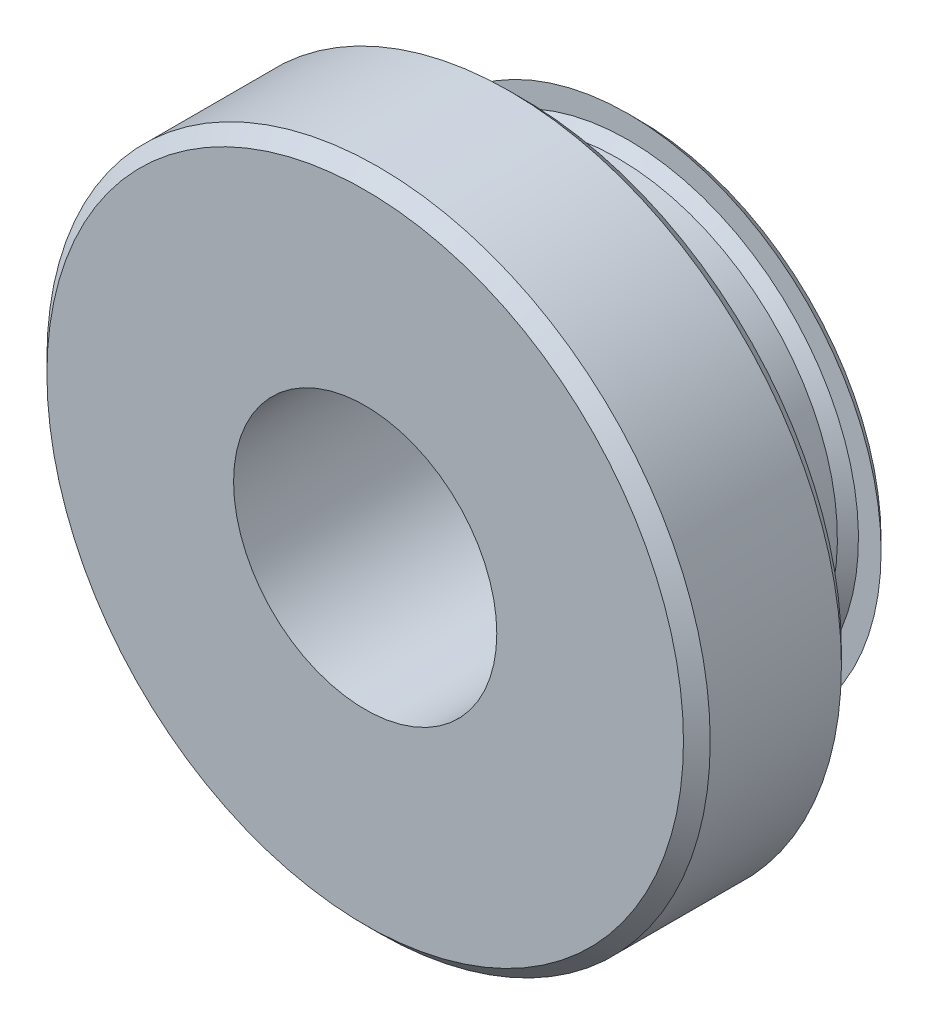
ISO-10303-21;
HEADER;
FILE_DESCRIPTION(('STEP AP214'),'2;1');
FILE_NAME('part.step','',(''),(''),'','','');
FILE_SCHEMA(('AUTOMOTIVE_DESIGN { 1 0 10303 214 1 1 1 1 }'));
ENDSEC;
DATA;
#1=APPLICATION_CONTEXT('core data for automotive mechanical design processes');
#2=APPLICATION_PROTOCOL_DEFINITION('international standard','automotive_design',2000,#1);
#3=PRODUCT_CONTEXT('',#1,'mechanical');
#4=PRODUCT('Part','Part','',(#3));
#5=PRODUCT_RELATED_PRODUCT_CATEGORY('part','',(#4));
#6=PRODUCT_DEFINITION_FORMATION('','',#4);
#7=PRODUCT_DEFINITION_CONTEXT('part definition',#1,'design');
#8=PRODUCT_DEFINITION('design','',#6,#7);
#9=PRODUCT_DEFINITION_SHAPE('','',#8);
#10=(LENGTH_UNIT() NAMED_UNIT(*) SI_UNIT(.MILLI.,.METRE.));
#11=(NAMED_UNIT(*) PLANE_ANGLE_UNIT() SI_UNIT($,.RADIAN.));
#12=(NAMED_UNIT(*) SI_UNIT($,.STERADIAN.) SOLID_ANGLE_UNIT());
#13=UNCERTAINTY_MEASURE_WITH_UNIT(LENGTH_MEASURE(1.E-05),#10,'distance_accuracy_value','');
#14=(GEOMETRIC_REPRESENTATION_CONTEXT(3) GLOBAL_UNCERTAINTY_ASSIGNED_CONTEXT((#13)) GLOBAL_UNIT_ASSIGNED_CONTEXT((#10,
#11,#12)) REPRESENTATION_CONTEXT('',''));
#15=CARTESIAN_POINT('',(0.,0.,0.));
#16=DIRECTION('',(0.,0.,1.));
#17=DIRECTION('',(1.,0.,0.));
#18=AXIS2_PLACEMENT_3D('',#15,#16,#17);
#19=CARTESIAN_POINT('',(0.,0.,-1.5));
#20=DIRECTION('',(0.,0.,1.));
#21=DIRECTION('',(1.,0.,0.));
#22=AXIS2_PLACEMENT_3D('',#19,#20,#21);
#23=PLANE('',#22);
#24=CARTESIAN_POINT('',(0.,0.,-1.5));
#25=DIRECTION('',(0.,0.,1.));
#26=DIRECTION('',(1.,0.,0.));
#27=AXIS2_PLACEMENT_3D('',#24,#25,#26);
#28=CIRCLE('',#27,3.023);
#29=CARTESIAN_POINT('',(3.023,0.,-1.5));
#30=VERTEX_POINT('',#29);
#31=EDGE_CURVE('E75',#30,#30,#28,.F.);
#32=ORIENTED_EDGE('',*,*,#31,.T.);
#33=EDGE_LOOP('',(#32));
#34=FACE_BOUND('',#33,.T.);
#35=CARTESIAN_POINT('',(0.,0.,-1.5));
#36=DIRECTION('',(0.,0.,-1.));
#37=DIRECTION('',(0.,1.,0.));
#38=AXIS2_PLACEMENT_3D('',#35,#36,#37);
#39=CIRCLE('',#38,2.085);
#40=CARTESIAN_POINT('',(0.,2.085,-1.5));
#41=VERTEX_POINT('',#40);
#42=EDGE_CURVE('E55',#41,#41,#39,.T.);
#43=ORIENTED_EDGE('',*,*,#42,.F.);
#44=EDGE_LOOP('',(#43));
#45=FACE_BOUND('',#44,.T.);
#46=ADVANCED_FACE('F34',(#34,#45),#23,.F.);
#47=CARTESIAN_POINT('',(0.,0.,-1.5));
#48=DIRECTION('',(0.,0.,1.));
#49=DIRECTION('',(1.,0.,0.));
#50=AXIS2_PLACEMENT_3D('',#47,#48,#49);
#51=CYLINDRICAL_SURFACE('',#50,3.15);
#52=CARTESIAN_POINT('',(0.,0.,-0.127000000000003));
#53=DIRECTION('',(0.,0.,1.));
#54=DIRECTION('',(1.,0.,0.));
#55=AXIS2_PLACEMENT_3D('',#52,#53,#54);
#56=CIRCLE('',#55,3.15);
#57=CARTESIAN_POINT('',(3.15,0.,-0.127000000000003));
#58=VERTEX_POINT('',#57);
#59=EDGE_CURVE('E72',#58,#58,#56,.F.);
#60=ORIENTED_EDGE('',*,*,#59,.T.);
#61=EDGE_LOOP('',(#60));
#62=FACE_BOUND('',#61,.T.);
#63=CARTESIAN_POINT('',(0.,0.,-1.373));
#64=DIRECTION('',(0.,0.,1.));
#65=DIRECTION('',(1.,0.,0.));
#66=AXIS2_PLACEMENT_3D('',#63,#64,#65);
#67=CIRCLE('',#66,3.15);
#68=CARTESIAN_POINT('',(3.15,0.,-1.373));
#69=VERTEX_POINT('',#68);
#70=EDGE_CURVE('E69',#69,#69,#67,.T.);
#71=ORIENTED_EDGE('',*,*,#70,.T.);
#72=EDGE_LOOP('',(#71));
#73=FACE_BOUND('',#72,.T.);
#74=ADVANCED_FACE('F106',(#62,#73),#51,.T.);
#75=CARTESIAN_POINT('',(0.,0.,0.));
#76=DIRECTION('',(0.,0.,1.));
#77=DIRECTION('',(1.,0.,0.));
#78=AXIS2_PLACEMENT_3D('',#75,#76,#77);
#79=PLANE('',#78);
#80=CARTESIAN_POINT('',(0.,0.,0.));
#81=DIRECTION('',(0.,0.,1.));
#82=DIRECTION('',(1.,0.,0.));
#83=AXIS2_PLACEMENT_3D('',#80,#81,#82);
#84=CIRCLE('',#83,1.24999999999999);
#85=CARTESIAN_POINT('',(1.24999999999999,0.,0.));
#86=VERTEX_POINT('',#85);
#87=EDGE_CURVE('E56',#86,#86,#84,.T.);
#88=ORIENTED_EDGE('',*,*,#87,.F.);
#89=EDGE_LOOP('',(#88));
#90=FACE_BOUND('',#89,.T.);
#91=CARTESIAN_POINT('',(0.,0.,0.));
#92=DIRECTION('',(0.,0.,1.));
#93=DIRECTION('',(1.,0.,0.));
#94=AXIS2_PLACEMENT_3D('',#91,#92,#93);
#95=CIRCLE('',#94,3.023);
#96=CARTESIAN_POINT('',(3.023,0.,0.));
#97=VERTEX_POINT('',#96);
#98=EDGE_CURVE('E60',#97,#97,#95,.T.);
#99=ORIENTED_EDGE('',*,*,#98,.T.);
#100=EDGE_LOOP('',(#99));
#101=FACE_BOUND('',#100,.T.);
#102=ADVANCED_FACE('F112',(#90,#101),#79,.T.);
#103=CARTESIAN_POINT('',(0.,0.,0.));
#104=DIRECTION('',(0.,0.,-1.));
#105=DIRECTION('',(-1.,0.,0.));
#106=AXIS2_PLACEMENT_3D('',#103,#104,#105);
#107=CONICAL_SURFACE('',#106,3.023,0.785398163397447);
#108=ORIENTED_EDGE('',*,*,#59,.F.);
#109=EDGE_LOOP('',(#108));
#110=FACE_BOUND('',#109,.T.);
#111=ORIENTED_EDGE('',*,*,#98,.F.);
#112=EDGE_LOOP('',(#111));
#113=FACE_BOUND('',#112,.T.);
#114=ADVANCED_FACE('F118',(#110,#113),#107,.T.);
#115=CARTESIAN_POINT('',(0.,0.,-1.373));
#116=DIRECTION('',(0.,0.,1.));
#117=DIRECTION('',(1.,0.,0.));
#118=AXIS2_PLACEMENT_3D('',#115,#116,#117);
#119=CONICAL_SURFACE('',#118,3.15,0.785398163397445);
#120=ORIENTED_EDGE('',*,*,#31,.F.);
#121=EDGE_LOOP('',(#120));
#122=FACE_BOUND('',#121,.T.);
#123=ORIENTED_EDGE('',*,*,#70,.F.);
#124=EDGE_LOOP('',(#123));
#125=FACE_BOUND('',#124,.T.);
#126=ADVANCED_FACE('F103',(#122,#125),#119,.T.);
#127=CARTESIAN_POINT('',(0.,0.,-2.6));
#128=DIRECTION('',(0.,0.,-1.));
#129=DIRECTION('',(-1.,0.,0.));
#130=AXIS2_PLACEMENT_3D('',#127,#128,#129);
#131=PLANE('',#130);
#132=CARTESIAN_POINT('',(0.,0.,-2.6));
#133=DIRECTION('',(0.,0.,-1.));
#134=DIRECTION('',(-1.,0.,0.));
#135=AXIS2_PLACEMENT_3D('',#132,#133,#134);
#136=CIRCLE('',#135,1.55);
#137=CARTESIAN_POINT('',(-1.55,0.,-2.6));
#138=VERTEX_POINT('',#137);
#139=EDGE_CURVE('E10',#138,#138,#136,.F.);
#140=ORIENTED_EDGE('',*,*,#139,.T.);
#141=EDGE_LOOP('',(#140));
#142=FACE_BOUND('',#141,.T.);
#143=CARTESIAN_POINT('',(0.,0.,-2.6));
#144=DIRECTION('',(0.,0.,-1.));
#145=DIRECTION('',(-1.,0.,0.));
#146=AXIS2_PLACEMENT_3D('',#143,#144,#145);
#147=CIRCLE('',#146,2.3);
#148=CARTESIAN_POINT('',(2.3,0.,-2.6));
#149=VERTEX_POINT('',#148);
#150=EDGE_CURVE('E41',#149,#149,#147,.T.);
#151=ORIENTED_EDGE('',*,*,#150,.T.);
#152=EDGE_LOOP('',(#151));
#153=FACE_BOUND('',#152,.T.);
#154=ADVANCED_FACE('F95',(#142,#153),#131,.T.);
#155=CARTESIAN_POINT('',(0.,0.,-2.5));
#156=DIRECTION('',(0.,0.,-1.));
#157=DIRECTION('',(0.,1.,0.));
#158=AXIS2_PLACEMENT_3D('',#155,#156,#157);
#159=PLANE('',#158);
#160=CARTESIAN_POINT('',(0.,0.,-2.5));
#161=DIRECTION('',(0.,0.,-1.));
#162=DIRECTION('',(0.,1.,0.));
#163=AXIS2_PLACEMENT_3D('',#160,#161,#162);
#164=CIRCLE('',#163,2.4);
#165=CARTESIAN_POINT('',(2.4,0.,-2.5));
#166=VERTEX_POINT('',#165);
#167=EDGE_CURVE('E45',#166,#166,#164,.F.);
#168=ORIENTED_EDGE('',*,*,#167,.T.);
#169=EDGE_LOOP('',(#168));
#170=FACE_BOUND('',#169,.T.);
#171=CARTESIAN_POINT('',(0.,0.,-2.5));
#172=DIRECTION('',(0.,0.,-1.));
#173=DIRECTION('',(0.,1.,0.));
#174=AXIS2_PLACEMENT_3D('',#171,#172,#173);
#175=CIRCLE('',#174,2.185);
#176=CARTESIAN_POINT('',(0.,2.185,-2.5));
#177=VERTEX_POINT('',#176);
#178=EDGE_CURVE('E78',#177,#177,#175,.T.);
#179=ORIENTED_EDGE('',*,*,#178,.T.);
#180=EDGE_LOOP('',(#179));
#181=FACE_BOUND('',#180,.T.);
#182=ADVANCED_FACE('F93',(#170,#181),#159,.F.);
#183=CARTESIAN_POINT('',(0.,0.,-2.5));
#184=DIRECTION('',(0.,0.,1.));
#185=DIRECTION('',(0.,-1.,0.));
#186=AXIS2_PLACEMENT_3D('',#183,#184,#185);
#187=CYLINDRICAL_SURFACE('',#186,2.085);
#188=CARTESIAN_POINT('',(0.,0.,-2.4));
#189=DIRECTION('',(0.,0.,-1.));
#190=DIRECTION('',(0.,1.,0.));
#191=AXIS2_PLACEMENT_3D('',#188,#189,#190);
#192=CIRCLE('',#191,2.085);
#193=CARTESIAN_POINT('',(0.,2.085,-2.4));
#194=VERTEX_POINT('',#193);
#195=EDGE_CURVE('E50',#194,#194,#192,.F.);
#196=ORIENTED_EDGE('',*,*,#195,.T.);
#197=EDGE_LOOP('',(#196));
#198=FACE_BOUND('',#197,.T.);
#199=ORIENTED_EDGE('',*,*,#42,.T.);
#200=EDGE_LOOP('',(#199));
#201=FACE_BOUND('',#200,.T.);
#202=ADVANCED_FACE('F83',(#198,#201),#187,.T.);
#203=CARTESIAN_POINT('',(0.,0.,-2.5));
#204=DIRECTION('',(0.,0.,-1.));
#205=DIRECTION('',(0.,1.,0.));
#206=AXIS2_PLACEMENT_3D('',#203,#204,#205);
#207=CONICAL_SURFACE('',#206,2.185,0.78539816339745);
#208=CARTESIAN_POINT('',(0.,2.085,-2.4));
#209=CARTESIAN_POINT('',(0.,2.08604166666667,-2.40104166666666));
#210=CARTESIAN_POINT('',(0.,2.08708333333333,-2.40208333333333));
#211=CARTESIAN_POINT('',(0.,2.08916666666667,-2.40416666666666));
#212=CARTESIAN_POINT('',(0.,2.09020833333333,-2.40520833333333));
#213=CARTESIAN_POINT('',(0.,2.09229166666667,-2.40729166666666));
#214=CARTESIAN_POINT('',(0.,2.09333333333333,-2.40833333333333));
#215=CARTESIAN_POINT('',(0.,2.09541666666667,-2.41041666666666));
#216=CARTESIAN_POINT('',(0.,2.09645833333333,-2.41145833333333));
#217=CARTESIAN_POINT('',(0.,2.09854166666667,-2.41354166666666));
#218=CARTESIAN_POINT('',(0.,2.09958333333333,-2.41458333333333));
#219=CARTESIAN_POINT('',(0.,2.10166666666667,-2.41666666666666));
#220=CARTESIAN_POINT('',(0.,2.10270833333333,-2.41770833333333));
#221=CARTESIAN_POINT('',(0.,2.10479166666667,-2.41979166666666));
#222=CARTESIAN_POINT('',(0.,2.10583333333333,-2.42083333333333));
#223=CARTESIAN_POINT('',(0.,2.10791666666667,-2.42291666666666));
#224=CARTESIAN_POINT('',(0.,2.10895833333333,-2.42395833333333));
#225=CARTESIAN_POINT('',(0.,2.11104166666667,-2.42604166666666));
#226=CARTESIAN_POINT('',(0.,2.11208333333333,-2.42708333333333));
#227=CARTESIAN_POINT('',(0.,2.11416666666667,-2.42916666666666));
#228=CARTESIAN_POINT('',(0.,2.11520833333333,-2.43020833333333));
#229=CARTESIAN_POINT('',(0.,2.11729166666667,-2.43229166666666));
#230=CARTESIAN_POINT('',(0.,2.11833333333333,-2.43333333333333));
#231=CARTESIAN_POINT('',(0.,2.12041666666667,-2.43541666666666));
#232=CARTESIAN_POINT('',(0.,2.12145833333333,-2.43645833333333));
#233=CARTESIAN_POINT('',(0.,2.12354166666667,-2.43854166666666));
#234=CARTESIAN_POINT('',(0.,2.12458333333333,-2.43958333333333));
#235=CARTESIAN_POINT('',(0.,2.12666666666667,-2.44166666666667));
#236=CARTESIAN_POINT('',(0.,2.12770833333333,-2.44270833333333));
#237=CARTESIAN_POINT('',(0.,2.12979166666667,-2.44479166666666));
#238=CARTESIAN_POINT('',(0.,2.13083333333333,-2.44583333333333));
#239=CARTESIAN_POINT('',(0.,2.13291666666667,-2.44791666666667));
#240=CARTESIAN_POINT('',(0.,2.13395833333333,-2.44895833333333));
#241=CARTESIAN_POINT('',(0.,2.13604166666667,-2.45104166666667));
#242=CARTESIAN_POINT('',(0.,2.13708333333333,-2.45208333333333));
#243=CARTESIAN_POINT('',(0.,2.13916666666667,-2.45416666666667));
#244=CARTESIAN_POINT('',(0.,2.14020833333333,-2.45520833333333));
#245=CARTESIAN_POINT('',(0.,2.14229166666667,-2.45729166666667));
#246=CARTESIAN_POINT('',(0.,2.14333333333333,-2.45833333333333));
#247=CARTESIAN_POINT('',(0.,2.14541666666667,-2.46041666666667));
#248=CARTESIAN_POINT('',(0.,2.14645833333333,-2.46145833333333));
#249=CARTESIAN_POINT('',(0.,2.14854166666667,-2.46354166666667));
#250=CARTESIAN_POINT('',(0.,2.14958333333333,-2.46458333333333));
#251=CARTESIAN_POINT('',(0.,2.15166666666667,-2.46666666666667));
#252=CARTESIAN_POINT('',(0.,2.15270833333334,-2.46770833333333));
#253=CARTESIAN_POINT('',(0.,2.15479166666667,-2.46979166666667));
#254=CARTESIAN_POINT('',(0.,2.15583333333334,-2.47083333333333));
#255=CARTESIAN_POINT('',(0.,2.15791666666667,-2.47291666666667));
#256=CARTESIAN_POINT('',(0.,2.15895833333334,-2.47395833333333));
#257=CARTESIAN_POINT('',(0.,2.16104166666667,-2.47604166666667));
#258=CARTESIAN_POINT('',(0.,2.16208333333334,-2.47708333333333));
#259=CARTESIAN_POINT('',(0.,2.16416666666667,-2.47916666666667));
#260=CARTESIAN_POINT('',(0.,2.16520833333334,-2.48020833333333));
#261=CARTESIAN_POINT('',(0.,2.16729166666667,-2.48229166666667));
#262=CARTESIAN_POINT('',(0.,2.16833333333334,-2.48333333333333));
#263=CARTESIAN_POINT('',(0.,2.17041666666667,-2.48541666666667));
#264=CARTESIAN_POINT('',(0.,2.17145833333334,-2.48645833333333));
#265=CARTESIAN_POINT('',(0.,2.17354166666667,-2.48854166666667));
#266=CARTESIAN_POINT('',(0.,2.17458333333334,-2.48958333333333));
#267=CARTESIAN_POINT('',(0.,2.17666666666667,-2.49166666666667));
#268=CARTESIAN_POINT('',(0.,2.17770833333334,-2.49270833333333));
#269=CARTESIAN_POINT('',(0.,2.17979166666667,-2.49479166666667));
#270=CARTESIAN_POINT('',(0.,2.18083333333334,-2.49583333333333));
#271=CARTESIAN_POINT('',(0.,2.18291666666667,-2.49791666666667));
#272=CARTESIAN_POINT('',(0.,2.18395833333334,-2.49895833333333));
#273=CARTESIAN_POINT('',(0.,2.185,-2.5));
#274=B_SPLINE_CURVE_WITH_KNOTS('',3,(#208,#209,#210,#211,#212,#213,#214,#215,#216,#217,#218,
#219,#220,#221,#222,#223,#224,#225,#226,#227,#228,#229,#230,#231,#232,#233,#234,#235,#236,#237,
#238,#239,#240,#241,#242,#243,#244,#245,#246,#247,#248,#249,#250,#251,#252,#253,#254,#255,#256,
#257,#258,#259,#260,#261,#262,#263,#264,#265,#266,#267,#268,#269,#270,#271,#272,#273),
.UNSPECIFIED.,.F.,.F.,(4,2,2,2,2,2,2,2,2,2,2,2,2,2,2,2,2,2,2,2,2,2,2,2,2,2,2,2,2,2,2,2,4),(0.,
0.00441941738241605,0.0088388347648321,0.0132582521472481,0.0176776695296642,0.0220970869120802,
0.0265165042944963,0.0309359216769123,0.0353553390593284,0.0397747564417444,0.0441941738241605,
0.0486135912065765,0.0530330085889929,0.0574524259714086,0.0618718433538247,0.0662912607362407,
0.0707106781186568,0.0751300955010728,0.0795495128834889,0.0839689302659049,0.088388347648321,
0.092807765030737,0.0972271824131531,0.101646599795569,0.106066017177985,0.110485434560402,
0.114904851942818,0.119324269325234,0.12374368670765,0.128163104090066,0.132582521472482,
0.137001938854898,0.141421356237314),.UNSPECIFIED.);
#275=EDGE_CURVE('BSEAM86',#194,#177,#274,.T.);
#276=ORIENTED_EDGE('',*,*,#195,.F.);
#277=ORIENTED_EDGE('',*,*,#178,.F.);
#278=ORIENTED_EDGE('',*,*,#275,.T.);
#279=ORIENTED_EDGE('',*,*,#275,.F.);
#280=EDGE_LOOP('',(#276,#278,#277,#279));
#281=FACE_BOUND('',#280,.T.);
#282=ADVANCED_FACE('F86',(#281),#207,.T.);
#283=CARTESIAN_POINT('',(0.,0.,-2.29999999999999));
#284=DIRECTION('',(0.,0.,1.));
#285=DIRECTION('',(1.,0.,0.));
#286=AXIS2_PLACEMENT_3D('',#283,#284,#285);
#287=CONICAL_SURFACE('',#286,2.6,0.785398163397443);
#288=CARTESIAN_POINT('',(2.3,0.,-2.6));
#289=CARTESIAN_POINT('',(2.30104166666666,0.,-2.59895833333333));
#290=CARTESIAN_POINT('',(2.30208333333333,0.,-2.59791666666667));
#291=CARTESIAN_POINT('',(2.30416666666666,0.,-2.59583333333333));
#292=CARTESIAN_POINT('',(2.30520833333333,0.,-2.59479166666667));
#293=CARTESIAN_POINT('',(2.30729166666666,0.,-2.59270833333333));
#294=CARTESIAN_POINT('',(2.30833333333333,0.,-2.59166666666667));
#295=CARTESIAN_POINT('',(2.31041666666666,0.,-2.58958333333333));
#296=CARTESIAN_POINT('',(2.31145833333333,0.,-2.58854166666667));
#297=CARTESIAN_POINT('',(2.31354166666666,0.,-2.58645833333333));
#298=CARTESIAN_POINT('',(2.31458333333333,0.,-2.58541666666667));
#299=CARTESIAN_POINT('',(2.31666666666666,0.,-2.58333333333333));
#300=CARTESIAN_POINT('',(2.31770833333333,0.,-2.58229166666667));
#301=CARTESIAN_POINT('',(2.31979166666666,0.,-2.58020833333333));
#302=CARTESIAN_POINT('',(2.32083333333333,0.,-2.57916666666667));
#303=CARTESIAN_POINT('',(2.32291666666666,0.,-2.57708333333333));
#304=CARTESIAN_POINT('',(2.32395833333333,0.,-2.57604166666667));
#305=CARTESIAN_POINT('',(2.32604166666666,0.,-2.57395833333333));
#306=CARTESIAN_POINT('',(2.32708333333333,0.,-2.57291666666667));
#307=CARTESIAN_POINT('',(2.32916666666666,0.,-2.57083333333333));
#308=CARTESIAN_POINT('',(2.33020833333333,0.,-2.56979166666667));
#309=CARTESIAN_POINT('',(2.33229166666666,0.,-2.56770833333333));
#310=CARTESIAN_POINT('',(2.33333333333333,0.,-2.56666666666667));
#311=CARTESIAN_POINT('',(2.33541666666666,0.,-2.56458333333333));
#312=CARTESIAN_POINT('',(2.33645833333333,0.,-2.56354166666667));
#313=CARTESIAN_POINT('',(2.33854166666666,0.,-2.56145833333333));
#314=CARTESIAN_POINT('',(2.33958333333333,0.,-2.56041666666667));
#315=CARTESIAN_POINT('',(2.34166666666666,0.,-2.55833333333333));
#316=CARTESIAN_POINT('',(2.34270833333333,0.,-2.55729166666667));
#317=CARTESIAN_POINT('',(2.34479166666666,0.,-2.55520833333333));
#318=CARTESIAN_POINT('',(2.34583333333333,0.,-2.55416666666667));
#319=CARTESIAN_POINT('',(2.34791666666666,0.,-2.55208333333333));
#320=CARTESIAN_POINT('',(2.34895833333333,0.,-2.55104166666667));
#321=CARTESIAN_POINT('',(2.35104166666666,0.,-2.54895833333333));
#322=CARTESIAN_POINT('',(2.35208333333333,0.,-2.54791666666667));
#323=CARTESIAN_POINT('',(2.35416666666666,0.,-2.54583333333333));
#324=CARTESIAN_POINT('',(2.35520833333333,0.,-2.54479166666667));
#325=CARTESIAN_POINT('',(2.35729166666666,0.,-2.54270833333333));
#326=CARTESIAN_POINT('',(2.35833333333333,0.,-2.54166666666667));
#327=CARTESIAN_POINT('',(2.36041666666666,0.,-2.53958333333333));
#328=CARTESIAN_POINT('',(2.36145833333333,0.,-2.53854166666667));
#329=CARTESIAN_POINT('',(2.36354166666666,0.,-2.53645833333333));
#330=CARTESIAN_POINT('',(2.36458333333333,0.,-2.53541666666667));
#331=CARTESIAN_POINT('',(2.36666666666666,0.,-2.53333333333333));
#332=CARTESIAN_POINT('',(2.36770833333333,0.,-2.53229166666667));
#333=CARTESIAN_POINT('',(2.36979166666666,0.,-2.53020833333333));
#334=CARTESIAN_POINT('',(2.37083333333333,0.,-2.52916666666667));
#335=CARTESIAN_POINT('',(2.37291666666666,0.,-2.52708333333333));
#336=CARTESIAN_POINT('',(2.37395833333333,0.,-2.52604166666667));
#337=CARTESIAN_POINT('',(2.37604166666666,0.,-2.52395833333333));
#338=CARTESIAN_POINT('',(2.37708333333333,0.,-2.52291666666667));
#339=CARTESIAN_POINT('',(2.37916666666666,0.,-2.52083333333333));
#340=CARTESIAN_POINT('',(2.38020833333333,0.,-2.51979166666667));
#341=CARTESIAN_POINT('',(2.38229166666666,0.,-2.51770833333333));
#342=CARTESIAN_POINT('',(2.38333333333333,0.,-2.51666666666667));
#343=CARTESIAN_POINT('',(2.38541666666666,0.,-2.51458333333333));
#344=CARTESIAN_POINT('',(2.38645833333333,0.,-2.51354166666667));
#345=CARTESIAN_POINT('',(2.38854166666666,0.,-2.51145833333333));
#346=CARTESIAN_POINT('',(2.38958333333333,0.,-2.51041666666667));
#347=CARTESIAN_POINT('',(2.39166666666666,0.,-2.50833333333333));
#348=CARTESIAN_POINT('',(2.39270833333333,0.,-2.50729166666667));
#349=CARTESIAN_POINT('',(2.39479166666666,0.,-2.50520833333333));
#350=CARTESIAN_POINT('',(2.39583333333333,0.,-2.50416666666667));
#351=CARTESIAN_POINT('',(2.39791666666666,0.,-2.50208333333333));
#352=CARTESIAN_POINT('',(2.39895833333333,0.,-2.50104166666667));
#353=CARTESIAN_POINT('',(2.4,0.,-2.5));
#354=B_SPLINE_CURVE_WITH_KNOTS('',3,(#288,#289,#290,#291,#292,#293,#294,#295,#296,#297,#298,
#299,#300,#301,#302,#303,#304,#305,#306,#307,#308,#309,#310,#311,#312,#313,#314,#315,#316,#317,
#318,#319,#320,#321,#322,#323,#324,#325,#326,#327,#328,#329,#330,#331,#332,#333,#334,#335,#336,
#337,#338,#339,#340,#341,#342,#343,#344,#345,#346,#347,#348,#349,#350,#351,#352,#353),
.UNSPECIFIED.,.F.,.F.,(4,2,2,2,2,2,2,2,2,2,2,2,2,2,2,2,2,2,2,2,2,2,2,2,2,2,2,2,2,2,2,2,4),(0.,
0.00441941738241544,0.00883883476483148,0.0132582521472475,0.0176776695296633,0.022097086912079,
0.0265165042944951,0.0309359216769108,0.0353553390593269,0.0397747564417426,0.0441941738241583,
0.0486135912065744,0.0530330085889904,0.0574524259714059,0.0618718433538219,0.066291260736238,
0.0707106781186537,0.0751300955010694,0.0795495128834855,0.0839689302659012,0.0883883476483173,
0.092807765030733,0.0972271824131487,0.101646599795565,0.106066017177981,0.110485434560396,
0.114904851942812,0.119324269325228,0.123743686707644,0.12816310409006,0.132582521472476,
0.137001938854892,0.141421356237308),.UNSPECIFIED.);
#355=EDGE_CURVE('BSEAM89',#149,#166,#354,.T.);
#356=ORIENTED_EDGE('',*,*,#150,.F.);
#357=ORIENTED_EDGE('',*,*,#167,.F.);
#358=ORIENTED_EDGE('',*,*,#355,.T.);
#359=ORIENTED_EDGE('',*,*,#355,.F.);
#360=EDGE_LOOP('',(#356,#358,#357,#359));
#361=FACE_BOUND('',#360,.T.);
#362=ADVANCED_FACE('F89',(#361),#287,.T.);
#363=CARTESIAN_POINT('',(0.,0.,-2.3));
#364=DIRECTION('',(0.,0.,-1.));
#365=DIRECTION('',(-1.,0.,0.));
#366=AXIS2_PLACEMENT_3D('',#363,#364,#365);
#367=CONICAL_SURFACE('',#366,1.25,0.785398163397453);
#368=ORIENTED_EDGE('',*,*,#139,.F.);
#369=EDGE_LOOP('',(#368));
#370=FACE_BOUND('',#369,.T.);
#371=CARTESIAN_POINT('',(0.,0.,-2.3));
#372=DIRECTION('',(0.,0.,-1.));
#373=DIRECTION('',(-1.,0.,0.));
#374=AXIS2_PLACEMENT_3D('',#371,#372,#373);
#375=CIRCLE('',#374,1.25);
#376=CARTESIAN_POINT('',(-1.25,0.,-2.3));
#377=VERTEX_POINT('',#376);
#378=EDGE_CURVE('E53',#377,#377,#375,.T.);
#379=ORIENTED_EDGE('',*,*,#378,.F.);
#380=EDGE_LOOP('',(#379));
#381=FACE_BOUND('',#380,.T.);
#382=ADVANCED_FACE('F36',(#370,#381),#367,.F.);
#383=CARTESIAN_POINT('',(0.,0.,0.));
#384=DIRECTION('',(0.,0.,1.));
#385=DIRECTION('',(1.,0.,0.));
#386=AXIS2_PLACEMENT_3D('',#383,#384,#385);
#387=CYLINDRICAL_SURFACE('',#386,1.24999999999999);
#388=ORIENTED_EDGE('',*,*,#378,.T.);
#389=EDGE_LOOP('',(#388));
#390=FACE_BOUND('',#389,.T.);
#391=ORIENTED_EDGE('',*,*,#87,.T.);
#392=EDGE_LOOP('',(#391));
#393=FACE_BOUND('',#392,.T.);
#394=ADVANCED_FACE('F131',(#390,#393),#387,.F.);
#395=CLOSED_SHELL('',(#46,#74,#102,#114,#126,#154,#182,#202,#282,#362,#382,#394));
#396=MANIFOLD_SOLID_BREP('B2',#395);
#397=ADVANCED_BREP_SHAPE_REPRESENTATION('',(#18,#396),#14);
#398=SHAPE_DEFINITION_REPRESENTATION(#9,#397);
ENDSEC;
END-ISO-10303-21;
